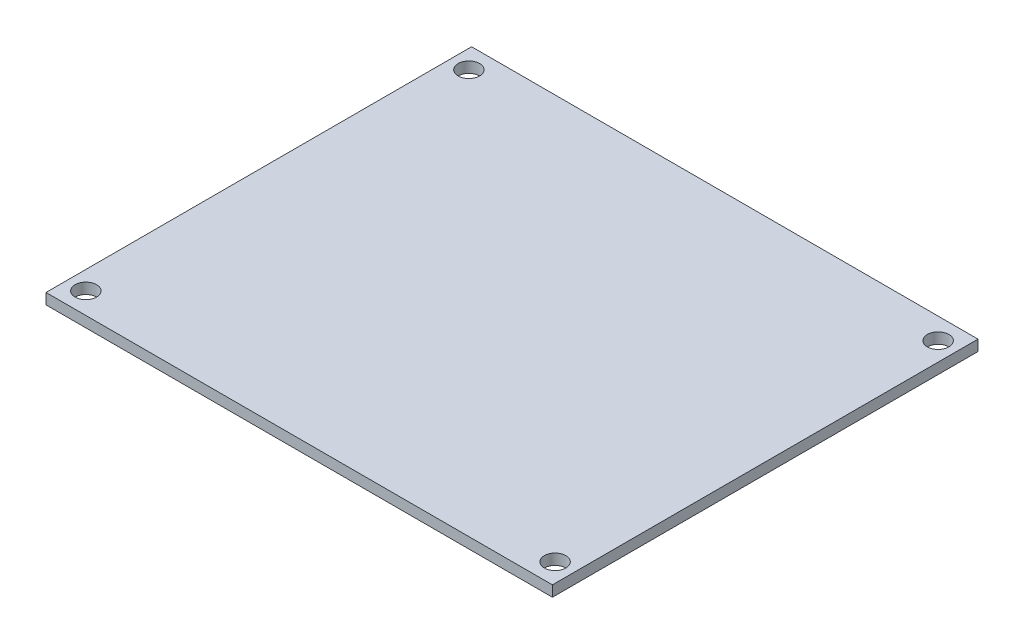
ISO-10303-21;
HEADER;
FILE_DESCRIPTION(('STEP AP214'),'2;1');
FILE_NAME('part.step','',(''),(''),'','','');
FILE_SCHEMA(('AUTOMOTIVE_DESIGN { 1 0 10303 214 1 1 1 1 }'));
ENDSEC;
DATA;
#1=APPLICATION_CONTEXT('core data for automotive mechanical design processes');
#2=APPLICATION_PROTOCOL_DEFINITION('international standard','automotive_design',2000,#1);
#3=PRODUCT_CONTEXT('',#1,'mechanical');
#4=PRODUCT('Part','Part','',(#3));
#5=PRODUCT_RELATED_PRODUCT_CATEGORY('part','',(#4));
#6=PRODUCT_DEFINITION_FORMATION('','',#4);
#7=PRODUCT_DEFINITION_CONTEXT('part definition',#1,'design');
#8=PRODUCT_DEFINITION('design','',#6,#7);
#9=PRODUCT_DEFINITION_SHAPE('','',#8);
#10=(LENGTH_UNIT() NAMED_UNIT(*) SI_UNIT(.MILLI.,.METRE.));
#11=(NAMED_UNIT(*) PLANE_ANGLE_UNIT() SI_UNIT($,.RADIAN.));
#12=(NAMED_UNIT(*) SI_UNIT($,.STERADIAN.) SOLID_ANGLE_UNIT());
#13=UNCERTAINTY_MEASURE_WITH_UNIT(LENGTH_MEASURE(1.E-05),#10,'distance_accuracy_value','');
#14=(GEOMETRIC_REPRESENTATION_CONTEXT(3) GLOBAL_UNCERTAINTY_ASSIGNED_CONTEXT((#13)) GLOBAL_UNIT_ASSIGNED_CONTEXT((#10,
#11,#12)) REPRESENTATION_CONTEXT('',''));
#15=CARTESIAN_POINT('',(0.,0.,0.));
#16=DIRECTION('',(0.,0.,1.));
#17=DIRECTION('',(1.,0.,0.));
#18=AXIS2_PLACEMENT_3D('',#15,#16,#17);
#19=CARTESIAN_POINT('',(47.,-2.,-39.5));
#20=DIRECTION('',(1.,0.,0.));
#21=DIRECTION('',(0.,0.,-1.));
#22=AXIS2_PLACEMENT_3D('',#19,#20,#21);
#23=PLANE('',#22);
#24=DIRECTION('',(0.,0.,-1.));
#25=VECTOR('',#24,1.);
#26=CARTESIAN_POINT('',(47.,0.,-39.5));
#27=LINE('',#26,#25);
#28=CARTESIAN_POINT('',(47.,0.,39.5));
#29=VERTEX_POINT('',#28);
#30=CARTESIAN_POINT('',(47.,0.,-39.5));
#31=VERTEX_POINT('',#30);
#32=EDGE_CURVE('E111',#29,#31,#27,.T.);
#33=ORIENTED_EDGE('',*,*,#32,.F.);
#34=DIRECTION('',(0.,1.,0.));
#35=VECTOR('',#34,1.);
#36=CARTESIAN_POINT('',(47.,-2.,39.5));
#37=LINE('',#36,#35);
#38=CARTESIAN_POINT('',(47.,-2.,39.5));
#39=VERTEX_POINT('',#38);
#40=EDGE_CURVE('E11',#39,#29,#37,.T.);
#41=ORIENTED_EDGE('',*,*,#40,.F.);
#42=DIRECTION('',(0.,0.,-1.));
#43=VECTOR('',#42,1.);
#44=CARTESIAN_POINT('',(47.,-2.,-39.5));
#45=LINE('',#44,#43);
#46=CARTESIAN_POINT('',(47.,-2.,-39.5));
#47=VERTEX_POINT('',#46);
#48=EDGE_CURVE('E104',#39,#47,#45,.T.);
#49=ORIENTED_EDGE('',*,*,#48,.T.);
#50=DIRECTION('',(0.,1.,0.));
#51=VECTOR('',#50,1.);
#52=CARTESIAN_POINT('',(47.,-2.,-39.5));
#53=LINE('',#52,#51);
#54=EDGE_CURVE('E49',#47,#31,#53,.T.);
#55=ORIENTED_EDGE('',*,*,#54,.T.);
#56=EDGE_LOOP('',(#33,#41,#49,#55));
#57=FACE_BOUND('',#56,.T.);
#58=ADVANCED_FACE('F46',(#57),#23,.T.);
#59=CARTESIAN_POINT('',(-47.,-2.,39.5));
#60=DIRECTION('',(0.,0.,1.));
#61=DIRECTION('',(1.,0.,0.));
#62=AXIS2_PLACEMENT_3D('',#59,#60,#61);
#63=PLANE('',#62);
#64=DIRECTION('',(1.,0.,0.));
#65=VECTOR('',#64,1.);
#66=CARTESIAN_POINT('',(-47.,0.,39.5));
#67=LINE('',#66,#65);
#68=CARTESIAN_POINT('',(-47.,0.,39.5));
#69=VERTEX_POINT('',#68);
#70=EDGE_CURVE('E106',#69,#29,#67,.T.);
#71=ORIENTED_EDGE('',*,*,#70,.F.);
#72=DIRECTION('',(0.,1.,0.));
#73=VECTOR('',#72,1.);
#74=CARTESIAN_POINT('',(-47.,-2.,39.5));
#75=LINE('',#74,#73);
#76=CARTESIAN_POINT('',(-47.,-2.,39.5));
#77=VERTEX_POINT('',#76);
#78=EDGE_CURVE('E55',#77,#69,#75,.T.);
#79=ORIENTED_EDGE('',*,*,#78,.F.);
#80=DIRECTION('',(1.,0.,0.));
#81=VECTOR('',#80,1.);
#82=CARTESIAN_POINT('',(-47.,-2.,39.5));
#83=LINE('',#82,#81);
#84=EDGE_CURVE('E101',#77,#39,#83,.T.);
#85=ORIENTED_EDGE('',*,*,#84,.T.);
#86=ORIENTED_EDGE('',*,*,#40,.T.);
#87=EDGE_LOOP('',(#71,#79,#85,#86));
#88=FACE_BOUND('',#87,.T.);
#89=ADVANCED_FACE('F122',(#88),#63,.T.);
#90=CARTESIAN_POINT('',(-47.,-2.,-39.5));
#91=DIRECTION('',(-1.,0.,0.));
#92=DIRECTION('',(0.,0.,1.));
#93=AXIS2_PLACEMENT_3D('',#90,#91,#92);
#94=PLANE('',#93);
#95=DIRECTION('',(0.,0.,1.));
#96=VECTOR('',#95,1.);
#97=CARTESIAN_POINT('',(-47.,0.,-39.5));
#98=LINE('',#97,#96);
#99=CARTESIAN_POINT('',(-47.,0.,-39.5));
#100=VERTEX_POINT('',#99);
#101=EDGE_CURVE('E96',#100,#69,#98,.T.);
#102=ORIENTED_EDGE('',*,*,#101,.F.);
#103=DIRECTION('',(0.,1.,0.));
#104=VECTOR('',#103,1.);
#105=CARTESIAN_POINT('',(-47.,-2.,-39.5));
#106=LINE('',#105,#104);
#107=CARTESIAN_POINT('',(-47.,-2.,-39.5));
#108=VERTEX_POINT('',#107);
#109=EDGE_CURVE('E91',#108,#100,#106,.T.);
#110=ORIENTED_EDGE('',*,*,#109,.F.);
#111=DIRECTION('',(0.,0.,1.));
#112=VECTOR('',#111,1.);
#113=CARTESIAN_POINT('',(-47.,-2.,-39.5));
#114=LINE('',#113,#112);
#115=EDGE_CURVE('E94',#108,#77,#114,.T.);
#116=ORIENTED_EDGE('',*,*,#115,.T.);
#117=ORIENTED_EDGE('',*,*,#78,.T.);
#118=EDGE_LOOP('',(#102,#110,#116,#117));
#119=FACE_BOUND('',#118,.T.);
#120=ADVANCED_FACE('F93',(#119),#94,.T.);
#121=CARTESIAN_POINT('',(-47.,-2.,-39.5));
#122=DIRECTION('',(0.,0.,-1.));
#123=DIRECTION('',(-1.,0.,0.));
#124=AXIS2_PLACEMENT_3D('',#121,#122,#123);
#125=PLANE('',#124);
#126=DIRECTION('',(-1.,0.,0.));
#127=VECTOR('',#126,1.);
#128=CARTESIAN_POINT('',(-47.,0.,-39.5));
#129=LINE('',#128,#127);
#130=EDGE_CURVE('E114',#31,#100,#129,.T.);
#131=ORIENTED_EDGE('',*,*,#130,.F.);
#132=ORIENTED_EDGE('',*,*,#54,.F.);
#133=DIRECTION('',(-1.,0.,0.));
#134=VECTOR('',#133,1.);
#135=CARTESIAN_POINT('',(-47.,-2.,-39.5));
#136=LINE('',#135,#134);
#137=EDGE_CURVE('E100',#47,#108,#136,.T.);
#138=ORIENTED_EDGE('',*,*,#137,.T.);
#139=ORIENTED_EDGE('',*,*,#109,.T.);
#140=EDGE_LOOP('',(#131,#132,#138,#139));
#141=FACE_BOUND('',#140,.T.);
#142=ADVANCED_FACE('F103',(#141),#125,.T.);
#143=CARTESIAN_POINT('',(0.,-2.,0.));
#144=DIRECTION('',(0.,1.,0.));
#145=DIRECTION('',(0.,0.,1.));
#146=AXIS2_PLACEMENT_3D('',#143,#144,#145);
#147=PLANE('',#146);
#148=CARTESIAN_POINT('',(43.55,-2.,35.55));
#149=DIRECTION('',(0.,1.,0.));
#150=DIRECTION('',(0.,0.,1.));
#151=AXIS2_PLACEMENT_3D('',#148,#149,#150);
#152=CIRCLE('',#151,1.99999999999999);
#153=CARTESIAN_POINT('',(43.55,-2.,37.55));
#154=VERTEX_POINT('',#153);
#155=EDGE_CURVE('E167',#154,#154,#152,.T.);
#156=ORIENTED_EDGE('',*,*,#155,.T.);
#157=EDGE_LOOP('',(#156));
#158=FACE_BOUND('',#157,.T.);
#159=CARTESIAN_POINT('',(-43.55,-2.,-35.55));
#160=DIRECTION('',(0.,1.,0.));
#161=DIRECTION('',(0.,0.,1.));
#162=AXIS2_PLACEMENT_3D('',#159,#160,#161);
#163=CIRCLE('',#162,1.99999999999999);
#164=CARTESIAN_POINT('',(-43.55,-2.,-33.55));
#165=VERTEX_POINT('',#164);
#166=EDGE_CURVE('E171',#165,#165,#163,.T.);
#167=ORIENTED_EDGE('',*,*,#166,.T.);
#168=EDGE_LOOP('',(#167));
#169=FACE_BOUND('',#168,.T.);
#170=CARTESIAN_POINT('',(-43.55,-2.,35.55));
#171=DIRECTION('',(0.,1.,0.));
#172=DIRECTION('',(0.,0.,1.));
#173=AXIS2_PLACEMENT_3D('',#170,#171,#172);
#174=CIRCLE('',#173,1.99999999999999);
#175=CARTESIAN_POINT('',(-43.55,-2.,37.55));
#176=VERTEX_POINT('',#175);
#177=EDGE_CURVE('E180',#176,#176,#174,.T.);
#178=ORIENTED_EDGE('',*,*,#177,.T.);
#179=EDGE_LOOP('',(#178));
#180=FACE_BOUND('',#179,.T.);
#181=CARTESIAN_POINT('',(43.55,-2.,-35.55));
#182=DIRECTION('',(0.,1.,0.));
#183=DIRECTION('',(0.,0.,1.));
#184=AXIS2_PLACEMENT_3D('',#181,#182,#183);
#185=CIRCLE('',#184,1.99999999999999);
#186=CARTESIAN_POINT('',(43.55,-2.,-33.55));
#187=VERTEX_POINT('',#186);
#188=EDGE_CURVE('E115',#187,#187,#185,.T.);
#189=ORIENTED_EDGE('',*,*,#188,.T.);
#190=EDGE_LOOP('',(#189));
#191=FACE_BOUND('',#190,.T.);
#192=ORIENTED_EDGE('',*,*,#48,.F.);
#193=ORIENTED_EDGE('',*,*,#84,.F.);
#194=ORIENTED_EDGE('',*,*,#115,.F.);
#195=ORIENTED_EDGE('',*,*,#137,.F.);
#196=EDGE_LOOP('',(#192,#193,#194,#195));
#197=FACE_BOUND('',#196,.T.);
#198=ADVANCED_FACE('F99',(#158,#169,#180,#191,#197),#147,.F.);
#199=CARTESIAN_POINT('',(0.,0.,0.));
#200=DIRECTION('',(0.,1.,0.));
#201=DIRECTION('',(0.,0.,1.));
#202=AXIS2_PLACEMENT_3D('',#199,#200,#201);
#203=PLANE('',#202);
#204=CARTESIAN_POINT('',(43.55,0.,35.55));
#205=DIRECTION('',(0.,1.,0.));
#206=DIRECTION('',(0.,0.,1.));
#207=AXIS2_PLACEMENT_3D('',#204,#205,#206);
#208=CIRCLE('',#207,1.99999999999999);
#209=CARTESIAN_POINT('',(43.55,0.,37.55));
#210=VERTEX_POINT('',#209);
#211=EDGE_CURVE('E165',#210,#210,#208,.T.);
#212=ORIENTED_EDGE('',*,*,#211,.F.);
#213=EDGE_LOOP('',(#212));
#214=FACE_BOUND('',#213,.T.);
#215=CARTESIAN_POINT('',(-43.55,0.,-35.55));
#216=DIRECTION('',(0.,1.,0.));
#217=DIRECTION('',(0.,0.,1.));
#218=AXIS2_PLACEMENT_3D('',#215,#216,#217);
#219=CIRCLE('',#218,1.99999999999999);
#220=CARTESIAN_POINT('',(-43.55,0.,-33.55));
#221=VERTEX_POINT('',#220);
#222=EDGE_CURVE('E168',#221,#221,#219,.T.);
#223=ORIENTED_EDGE('',*,*,#222,.F.);
#224=EDGE_LOOP('',(#223));
#225=FACE_BOUND('',#224,.T.);
#226=CARTESIAN_POINT('',(-43.55,0.,35.55));
#227=DIRECTION('',(0.,1.,0.));
#228=DIRECTION('',(0.,0.,1.));
#229=AXIS2_PLACEMENT_3D('',#226,#227,#228);
#230=CIRCLE('',#229,1.99999999999999);
#231=CARTESIAN_POINT('',(-43.55,0.,37.55));
#232=VERTEX_POINT('',#231);
#233=EDGE_CURVE('E177',#232,#232,#230,.T.);
#234=ORIENTED_EDGE('',*,*,#233,.F.);
#235=EDGE_LOOP('',(#234));
#236=FACE_BOUND('',#235,.T.);
#237=CARTESIAN_POINT('',(43.55,0.,-35.55));
#238=DIRECTION('',(0.,1.,0.));
#239=DIRECTION('',(0.,0.,1.));
#240=AXIS2_PLACEMENT_3D('',#237,#238,#239);
#241=CIRCLE('',#240,1.99999999999999);
#242=CARTESIAN_POINT('',(43.55,0.,-33.55));
#243=VERTEX_POINT('',#242);
#244=EDGE_CURVE('E183',#243,#243,#241,.T.);
#245=ORIENTED_EDGE('',*,*,#244,.F.);
#246=EDGE_LOOP('',(#245));
#247=FACE_BOUND('',#246,.T.);
#248=ORIENTED_EDGE('',*,*,#32,.T.);
#249=ORIENTED_EDGE('',*,*,#130,.T.);
#250=ORIENTED_EDGE('',*,*,#101,.T.);
#251=ORIENTED_EDGE('',*,*,#70,.T.);
#252=EDGE_LOOP('',(#248,#249,#250,#251));
#253=FACE_BOUND('',#252,.T.);
#254=ADVANCED_FACE('F121',(#214,#225,#236,#247,#253),#203,.T.);
#255=CARTESIAN_POINT('',(43.55,0.,-35.55));
#256=DIRECTION('',(0.,1.,0.));
#257=DIRECTION('',(0.,0.,1.));
#258=AXIS2_PLACEMENT_3D('',#255,#256,#257);
#259=CYLINDRICAL_SURFACE('',#258,1.99999999999999);
#260=ORIENTED_EDGE('',*,*,#244,.T.);
#261=EDGE_LOOP('',(#260));
#262=FACE_BOUND('',#261,.T.);
#263=ORIENTED_EDGE('',*,*,#188,.F.);
#264=EDGE_LOOP('',(#263));
#265=FACE_BOUND('',#264,.T.);
#266=ADVANCED_FACE('F141',(#262,#265),#259,.F.);
#267=CARTESIAN_POINT('',(-43.55,0.,35.55));
#268=DIRECTION('',(0.,1.,0.));
#269=DIRECTION('',(0.,0.,1.));
#270=AXIS2_PLACEMENT_3D('',#267,#268,#269);
#271=CYLINDRICAL_SURFACE('',#270,1.99999999999999);
#272=ORIENTED_EDGE('',*,*,#233,.T.);
#273=EDGE_LOOP('',(#272));
#274=FACE_BOUND('',#273,.T.);
#275=ORIENTED_EDGE('',*,*,#177,.F.);
#276=EDGE_LOOP('',(#275));
#277=FACE_BOUND('',#276,.T.);
#278=ADVANCED_FACE('F148',(#274,#277),#271,.F.);
#279=CARTESIAN_POINT('',(-43.55,0.,-35.55));
#280=DIRECTION('',(0.,1.,0.));
#281=DIRECTION('',(0.,0.,1.));
#282=AXIS2_PLACEMENT_3D('',#279,#280,#281);
#283=CYLINDRICAL_SURFACE('',#282,1.99999999999999);
#284=ORIENTED_EDGE('',*,*,#222,.T.);
#285=EDGE_LOOP('',(#284));
#286=FACE_BOUND('',#285,.T.);
#287=ORIENTED_EDGE('',*,*,#166,.F.);
#288=EDGE_LOOP('',(#287));
#289=FACE_BOUND('',#288,.T.);
#290=ADVANCED_FACE('F152',(#286,#289),#283,.F.);
#291=CARTESIAN_POINT('',(43.55,0.,35.55));
#292=DIRECTION('',(0.,1.,0.));
#293=DIRECTION('',(0.,0.,1.));
#294=AXIS2_PLACEMENT_3D('',#291,#292,#293);
#295=CYLINDRICAL_SURFACE('',#294,1.99999999999999);
#296=ORIENTED_EDGE('',*,*,#211,.T.);
#297=EDGE_LOOP('',(#296));
#298=FACE_BOUND('',#297,.T.);
#299=ORIENTED_EDGE('',*,*,#155,.F.);
#300=EDGE_LOOP('',(#299));
#301=FACE_BOUND('',#300,.T.);
#302=ADVANCED_FACE('F156',(#298,#301),#295,.F.);
#303=CLOSED_SHELL('',(#58,#89,#120,#142,#198,#254,#266,#278,#290,#302));
#304=MANIFOLD_SOLID_BREP('B2',#303);
#305=ADVANCED_BREP_SHAPE_REPRESENTATION('',(#18,#304),#14);
#306=SHAPE_DEFINITION_REPRESENTATION(#9,#305);
ENDSEC;
END-ISO-10303-21;
